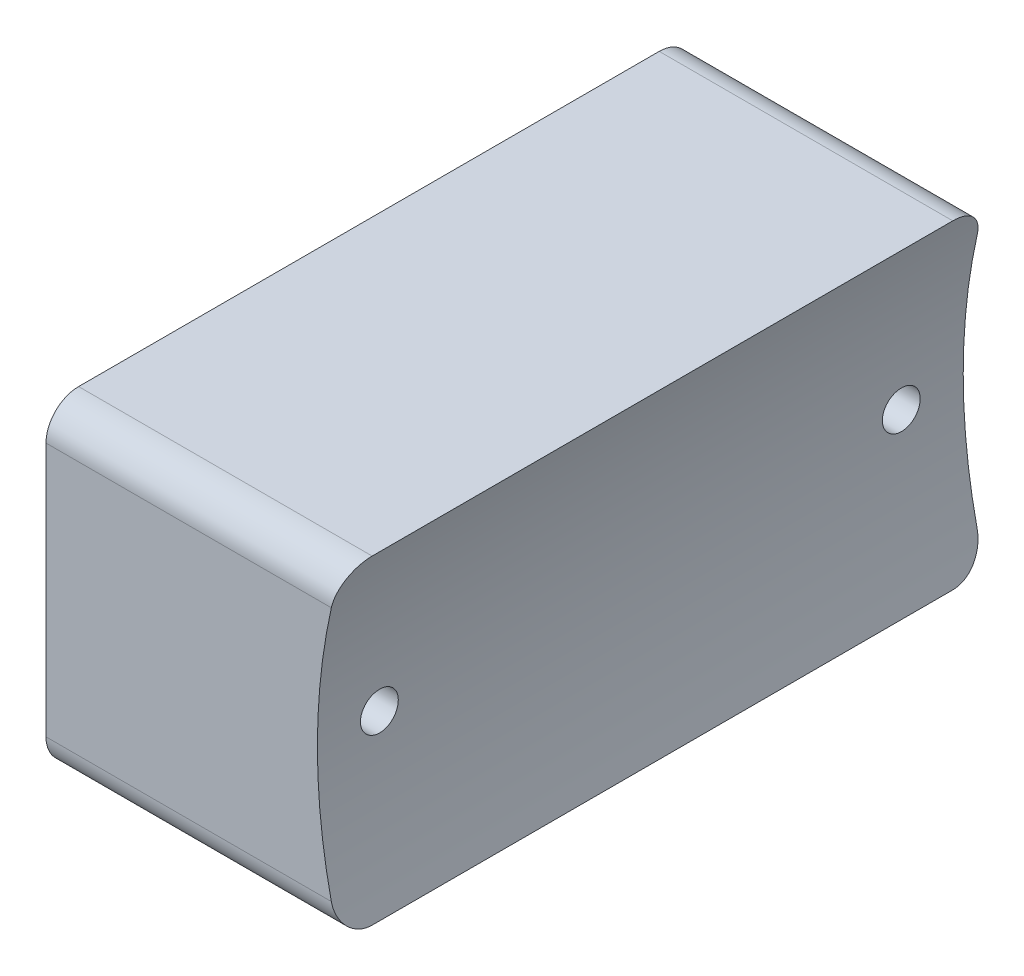
ISO-10303-21;
HEADER;
FILE_DESCRIPTION(('STEP AP214'),'2;1');
FILE_NAME('part.step','',(''),(''),'','','');
FILE_SCHEMA(('AUTOMOTIVE_DESIGN { 1 0 10303 214 1 1 1 1 }'));
ENDSEC;
DATA;
#1=APPLICATION_CONTEXT('core data for automotive mechanical design processes');
#2=APPLICATION_PROTOCOL_DEFINITION('international standard','automotive_design',2000,#1);
#3=PRODUCT_CONTEXT('',#1,'mechanical');
#4=PRODUCT('Part','Part','',(#3));
#5=PRODUCT_RELATED_PRODUCT_CATEGORY('part','',(#4));
#6=PRODUCT_DEFINITION_FORMATION('','',#4);
#7=PRODUCT_DEFINITION_CONTEXT('part definition',#1,'design');
#8=PRODUCT_DEFINITION('design','',#6,#7);
#9=PRODUCT_DEFINITION_SHAPE('','',#8);
#10=(LENGTH_UNIT() NAMED_UNIT(*) SI_UNIT(.MILLI.,.METRE.));
#11=(NAMED_UNIT(*) PLANE_ANGLE_UNIT() SI_UNIT($,.RADIAN.));
#12=(NAMED_UNIT(*) SI_UNIT($,.STERADIAN.) SOLID_ANGLE_UNIT());
#13=UNCERTAINTY_MEASURE_WITH_UNIT(LENGTH_MEASURE(1.E-05),#10,'distance_accuracy_value','');
#14=(GEOMETRIC_REPRESENTATION_CONTEXT(3) GLOBAL_UNCERTAINTY_ASSIGNED_CONTEXT((#13)) GLOBAL_UNIT_ASSIGNED_CONTEXT((#10,
#11,#12)) REPRESENTATION_CONTEXT('',''));
#15=CARTESIAN_POINT('',(0.,0.,0.));
#16=DIRECTION('',(0.,0.,1.));
#17=DIRECTION('',(1.,0.,0.));
#18=AXIS2_PLACEMENT_3D('',#15,#16,#17);
#19=CARTESIAN_POINT('',(22.5,12.25,24.75));
#20=DIRECTION('',(0.,-1.,0.));
#21=DIRECTION('',(0.,0.,-1.));
#22=AXIS2_PLACEMENT_3D('',#19,#20,#21);
#23=PLANE('',#22);
#24=DIRECTION('',(0.,0.,1.));
#25=VECTOR('',#24,1.);
#26=CARTESIAN_POINT('',(0.,12.25,24.75));
#27=LINE('',#26,#25);
#28=CARTESIAN_POINT('',(0.,12.25,-22.25));
#29=VERTEX_POINT('',#28);
#30=CARTESIAN_POINT('',(0.,12.25,22.25));
#31=VERTEX_POINT('',#30);
#32=EDGE_CURVE('E184',#29,#31,#27,.T.);
#33=ORIENTED_EDGE('',*,*,#32,.T.);
#34=DIRECTION('',(-1.,0.,0.));
#35=VECTOR('',#34,1.);
#36=CARTESIAN_POINT('',(22.5,12.25,22.25));
#37=LINE('',#36,#35);
#38=CARTESIAN_POINT('',(22.5,12.25,22.25));
#39=VERTEX_POINT('',#38);
#40=EDGE_CURVE('E59',#31,#39,#37,.F.);
#41=ORIENTED_EDGE('',*,*,#40,.T.);
#42=DIRECTION('',(0.,0.,1.));
#43=VECTOR('',#42,1.);
#44=CARTESIAN_POINT('',(22.5,12.25,24.75));
#45=LINE('',#44,#43);
#46=CARTESIAN_POINT('',(22.5,12.25,-22.25));
#47=VERTEX_POINT('',#46);
#48=EDGE_CURVE('E193',#47,#39,#45,.T.);
#49=ORIENTED_EDGE('',*,*,#48,.F.);
#50=DIRECTION('',(-1.,0.,0.));
#51=VECTOR('',#50,1.);
#52=CARTESIAN_POINT('',(22.5,12.25,-22.25));
#53=LINE('',#52,#51);
#54=EDGE_CURVE('E271',#47,#29,#53,.T.);
#55=ORIENTED_EDGE('',*,*,#54,.T.);
#56=EDGE_LOOP('',(#33,#41,#49,#55));
#57=FACE_BOUND('',#56,.T.);
#58=ADVANCED_FACE('F43',(#57),#23,.F.);
#59=CARTESIAN_POINT('',(22.5,-12.25,24.75));
#60=DIRECTION('',(0.,0.,-1.));
#61=DIRECTION('',(0.,1.,0.));
#62=AXIS2_PLACEMENT_3D('',#59,#60,#61);
#63=PLANE('',#62);
#64=DIRECTION('',(0.,-1.,0.));
#65=VECTOR('',#64,1.);
#66=CARTESIAN_POINT('',(0.,-12.25,24.75));
#67=LINE('',#66,#65);
#68=CARTESIAN_POINT('',(0.,9.75,24.75));
#69=VERTEX_POINT('',#68);
#70=CARTESIAN_POINT('',(0.,-9.75,24.75));
#71=VERTEX_POINT('',#70);
#72=EDGE_CURVE('E201',#69,#71,#67,.T.);
#73=ORIENTED_EDGE('',*,*,#72,.T.);
#74=DIRECTION('',(-1.,0.,0.));
#75=VECTOR('',#74,1.);
#76=CARTESIAN_POINT('',(22.5,-9.75,24.75));
#77=LINE('',#76,#75);
#78=CARTESIAN_POINT('',(21.8694945585489,-9.75,24.75));
#79=VERTEX_POINT('',#78);
#80=EDGE_CURVE('E292',#71,#79,#77,.F.);
#81=ORIENTED_EDGE('',*,*,#80,.T.);
#82=CARTESIAN_POINT('',(65.8005484953713,0.,24.75));
#83=DIRECTION('',(0.,0.,-1.));
#84=DIRECTION('',(0.,1.,0.));
#85=AXIS2_PLACEMENT_3D('',#82,#83,#84);
#86=CIRCLE('',#85,45.);
#87=CARTESIAN_POINT('',(21.8694945585489,9.75,24.75));
#88=VERTEX_POINT('',#87);
#89=EDGE_CURVE('E165',#79,#88,#86,.T.);
#90=ORIENTED_EDGE('',*,*,#89,.T.);
#91=DIRECTION('',(-1.,0.,0.));
#92=VECTOR('',#91,1.);
#93=CARTESIAN_POINT('',(22.5,9.75,24.75));
#94=LINE('',#93,#92);
#95=EDGE_CURVE('E294',#88,#69,#94,.T.);
#96=ORIENTED_EDGE('',*,*,#95,.T.);
#97=EDGE_LOOP('',(#73,#81,#90,#96));
#98=FACE_BOUND('',#97,.T.);
#99=ADVANCED_FACE('F245',(#98),#63,.F.);
#100=CARTESIAN_POINT('',(22.5,-12.25,24.75));
#101=DIRECTION('',(0.,1.,0.));
#102=DIRECTION('',(0.,0.,1.));
#103=AXIS2_PLACEMENT_3D('',#100,#101,#102);
#104=PLANE('',#103);
#105=DIRECTION('',(0.,0.,-1.));
#106=VECTOR('',#105,1.);
#107=CARTESIAN_POINT('',(22.5,-12.25,24.75));
#108=LINE('',#107,#106);
#109=CARTESIAN_POINT('',(22.5,-12.25,22.25));
#110=VERTEX_POINT('',#109);
#111=CARTESIAN_POINT('',(22.5,-12.25,-22.25));
#112=VERTEX_POINT('',#111);
#113=EDGE_CURVE('E195',#110,#112,#108,.T.);
#114=ORIENTED_EDGE('',*,*,#113,.F.);
#115=DIRECTION('',(-1.,0.,0.));
#116=VECTOR('',#115,1.);
#117=CARTESIAN_POINT('',(22.5,-12.25,22.25));
#118=LINE('',#117,#116);
#119=CARTESIAN_POINT('',(0.,-12.25,22.25));
#120=VERTEX_POINT('',#119);
#121=EDGE_CURVE('E321',#110,#120,#118,.T.);
#122=ORIENTED_EDGE('',*,*,#121,.T.);
#123=DIRECTION('',(0.,0.,-1.));
#124=VECTOR('',#123,1.);
#125=CARTESIAN_POINT('',(0.,-12.25,24.75));
#126=LINE('',#125,#124);
#127=CARTESIAN_POINT('',(0.,-12.25,-22.25));
#128=VERTEX_POINT('',#127);
#129=EDGE_CURVE('E204',#120,#128,#126,.T.);
#130=ORIENTED_EDGE('',*,*,#129,.T.);
#131=DIRECTION('',(-1.,0.,0.));
#132=VECTOR('',#131,1.);
#133=CARTESIAN_POINT('',(22.5,-12.25,-22.25));
#134=LINE('',#133,#132);
#135=EDGE_CURVE('E199',#128,#112,#134,.F.);
#136=ORIENTED_EDGE('',*,*,#135,.T.);
#137=EDGE_LOOP('',(#114,#122,#130,#136));
#138=FACE_BOUND('',#137,.T.);
#139=ADVANCED_FACE('F251',(#138),#104,.F.);
#140=CARTESIAN_POINT('',(22.5,-12.25,-24.75));
#141=DIRECTION('',(0.,0.,1.));
#142=DIRECTION('',(1.,0.,0.));
#143=AXIS2_PLACEMENT_3D('',#140,#141,#142);
#144=PLANE('',#143);
#145=CARTESIAN_POINT('',(65.8005484953713,0.,-24.75));
#146=DIRECTION('',(0.,0.,-1.));
#147=DIRECTION('',(1.,0.,0.));
#148=AXIS2_PLACEMENT_3D('',#145,#146,#147);
#149=CIRCLE('',#148,45.);
#150=CARTESIAN_POINT('',(21.8694945585489,-9.75,-24.75));
#151=VERTEX_POINT('',#150);
#152=CARTESIAN_POINT('',(21.8694945585489,9.75,-24.75));
#153=VERTEX_POINT('',#152);
#154=EDGE_CURVE('E284',#151,#153,#149,.T.);
#155=ORIENTED_EDGE('',*,*,#154,.F.);
#156=DIRECTION('',(-1.,0.,0.));
#157=VECTOR('',#156,1.);
#158=CARTESIAN_POINT('',(22.5,-9.75,-24.75));
#159=LINE('',#158,#157);
#160=CARTESIAN_POINT('',(0.,-9.75,-24.75));
#161=VERTEX_POINT('',#160);
#162=EDGE_CURVE('E11',#151,#161,#159,.T.);
#163=ORIENTED_EDGE('',*,*,#162,.T.);
#164=DIRECTION('',(0.,1.,0.));
#165=VECTOR('',#164,1.);
#166=CARTESIAN_POINT('',(0.,-12.25,-24.75));
#167=LINE('',#166,#165);
#168=CARTESIAN_POINT('',(0.,9.75,-24.75));
#169=VERTEX_POINT('',#168);
#170=EDGE_CURVE('E196',#161,#169,#167,.T.);
#171=ORIENTED_EDGE('',*,*,#170,.T.);
#172=DIRECTION('',(-1.,0.,0.));
#173=VECTOR('',#172,1.);
#174=CARTESIAN_POINT('',(22.5,9.75,-24.75));
#175=LINE('',#174,#173);
#176=EDGE_CURVE('E52',#169,#153,#175,.F.);
#177=ORIENTED_EDGE('',*,*,#176,.T.);
#178=EDGE_LOOP('',(#155,#163,#171,#177));
#179=FACE_BOUND('',#178,.T.);
#180=ADVANCED_FACE('F283',(#179),#144,.F.);
#181=CARTESIAN_POINT('',(0.,0.,0.));
#182=DIRECTION('',(1.,0.,0.));
#183=DIRECTION('',(0.,0.,-1.));
#184=AXIS2_PLACEMENT_3D('',#181,#182,#183);
#185=PLANE('',#184);
#186=DIRECTION('',(0.,0.,-1.));
#187=VECTOR('',#186,1.);
#188=CARTESIAN_POINT('',(0.,10.,-7.59999999999674));
#189=LINE('',#188,#187);
#190=CARTESIAN_POINT('',(0.,10.,7.60000000000326));
#191=VERTEX_POINT('',#190);
#192=CARTESIAN_POINT('',(0.,10.,-7.59999999999674));
#193=VERTEX_POINT('',#192);
#194=EDGE_CURVE('E171',#191,#193,#189,.T.);
#195=ORIENTED_EDGE('',*,*,#194,.F.);
#196=DIRECTION('',(0.,1.,0.));
#197=VECTOR('',#196,1.);
#198=CARTESIAN_POINT('',(0.,7.5,7.60000000000326));
#199=LINE('',#198,#197);
#200=CARTESIAN_POINT('',(0.,7.5,7.60000000000326));
#201=VERTEX_POINT('',#200);
#202=EDGE_CURVE('E142',#201,#191,#199,.T.);
#203=ORIENTED_EDGE('',*,*,#202,.F.);
#204=DIRECTION('',(0.,0.,1.));
#205=VECTOR('',#204,1.);
#206=CARTESIAN_POINT('',(0.,7.5,-7.59999999999674));
#207=LINE('',#206,#205);
#208=CARTESIAN_POINT('',(0.,7.5,-7.59999999999674));
#209=VERTEX_POINT('',#208);
#210=EDGE_CURVE('E159',#209,#201,#207,.T.);
#211=ORIENTED_EDGE('',*,*,#210,.F.);
#212=DIRECTION('',(0.,-1.,0.));
#213=VECTOR('',#212,1.);
#214=CARTESIAN_POINT('',(0.,7.5,-7.59999999999674));
#215=LINE('',#214,#213);
#216=EDGE_CURVE('E162',#193,#209,#215,.T.);
#217=ORIENTED_EDGE('',*,*,#216,.F.);
#218=EDGE_LOOP('',(#195,#203,#211,#217));
#219=FACE_BOUND('',#218,.T.);
#220=CARTESIAN_POINT('',(0.,-7.25,-20.));
#221=DIRECTION('',(-1.,0.,0.));
#222=DIRECTION('',(0.,0.,1.));
#223=AXIS2_PLACEMENT_3D('',#220,#221,#222);
#224=CIRCLE('',#223,2.5);
#225=CARTESIAN_POINT('',(0.,-7.25,-17.5));
#226=VERTEX_POINT('',#225);
#227=EDGE_CURVE('E185',#226,#226,#224,.T.);
#228=ORIENTED_EDGE('',*,*,#227,.F.);
#229=EDGE_LOOP('',(#228));
#230=FACE_BOUND('',#229,.T.);
#231=CARTESIAN_POINT('',(0.,-7.25,20.));
#232=DIRECTION('',(-1.,0.,0.));
#233=DIRECTION('',(0.,0.,1.));
#234=AXIS2_PLACEMENT_3D('',#231,#232,#233);
#235=CIRCLE('',#234,2.5);
#236=CARTESIAN_POINT('',(0.,-7.25,22.5));
#237=VERTEX_POINT('',#236);
#238=EDGE_CURVE('E188',#237,#237,#235,.T.);
#239=ORIENTED_EDGE('',*,*,#238,.F.);
#240=EDGE_LOOP('',(#239));
#241=FACE_BOUND('',#240,.T.);
#242=ORIENTED_EDGE('',*,*,#129,.F.);
#243=CARTESIAN_POINT('',(0.,-9.75,22.25));
#244=DIRECTION('',(1.,0.,0.));
#245=DIRECTION('',(0.,0.,-1.));
#246=AXIS2_PLACEMENT_3D('',#243,#244,#245);
#247=CIRCLE('',#246,2.5);
#248=EDGE_CURVE('E329',#120,#71,#247,.F.);
#249=ORIENTED_EDGE('',*,*,#248,.T.);
#250=ORIENTED_EDGE('',*,*,#72,.F.);
#251=CARTESIAN_POINT('',(0.,9.75,22.25));
#252=DIRECTION('',(1.,0.,0.));
#253=DIRECTION('',(0.,0.,-1.));
#254=AXIS2_PLACEMENT_3D('',#251,#252,#253);
#255=CIRCLE('',#254,2.5);
#256=EDGE_CURVE('E323',#69,#31,#255,.F.);
#257=ORIENTED_EDGE('',*,*,#256,.T.);
#258=ORIENTED_EDGE('',*,*,#32,.F.);
#259=CARTESIAN_POINT('',(0.,9.75,-22.25));
#260=DIRECTION('',(1.,0.,0.));
#261=DIRECTION('',(0.,0.,-1.));
#262=AXIS2_PLACEMENT_3D('',#259,#260,#261);
#263=CIRCLE('',#262,2.5);
#264=EDGE_CURVE('E320',#29,#169,#263,.F.);
#265=ORIENTED_EDGE('',*,*,#264,.T.);
#266=ORIENTED_EDGE('',*,*,#170,.F.);
#267=CARTESIAN_POINT('',(0.,-9.75,-22.25));
#268=DIRECTION('',(1.,0.,0.));
#269=DIRECTION('',(0.,0.,-1.));
#270=AXIS2_PLACEMENT_3D('',#267,#268,#269);
#271=CIRCLE('',#270,2.5);
#272=EDGE_CURVE('E315',#161,#128,#271,.F.);
#273=ORIENTED_EDGE('',*,*,#272,.T.);
#274=EDGE_LOOP('',(#242,#249,#250,#257,#258,#265,#266,#273));
#275=FACE_BOUND('',#274,.T.);
#276=ADVANCED_FACE('F318',(#219,#230,#241,#275),#185,.F.);
#277=CARTESIAN_POINT('',(3.,-7.25,20.));
#278=DIRECTION('',(-1.,0.,0.));
#279=DIRECTION('',(0.,0.,1.));
#280=AXIS2_PLACEMENT_3D('',#277,#278,#279);
#281=CYLINDRICAL_SURFACE('',#280,2.5);
#282=CARTESIAN_POINT('',(3.,-7.25,20.));
#283=DIRECTION('',(-1.,0.,0.));
#284=DIRECTION('',(0.,0.,1.));
#285=AXIS2_PLACEMENT_3D('',#282,#283,#284);
#286=CIRCLE('',#285,2.5);
#287=CARTESIAN_POINT('',(3.,-7.25,22.5));
#288=VERTEX_POINT('',#287);
#289=EDGE_CURVE('E177',#288,#288,#286,.T.);
#290=ORIENTED_EDGE('',*,*,#289,.F.);
#291=EDGE_LOOP('',(#290));
#292=FACE_BOUND('',#291,.T.);
#293=ORIENTED_EDGE('',*,*,#238,.T.);
#294=EDGE_LOOP('',(#293));
#295=FACE_BOUND('',#294,.T.);
#296=ADVANCED_FACE('F348',(#292,#295),#281,.F.);
#297=CARTESIAN_POINT('',(3.,-7.25,20.));
#298=DIRECTION('',(-1.,0.,0.));
#299=DIRECTION('',(0.,0.,1.));
#300=AXIS2_PLACEMENT_3D('',#297,#298,#299);
#301=PLANE('',#300);
#302=ORIENTED_EDGE('',*,*,#289,.T.);
#303=EDGE_LOOP('',(#302));
#304=FACE_BOUND('',#303,.T.);
#305=ADVANCED_FACE('F350',(#304),#301,.T.);
#306=CARTESIAN_POINT('',(3.,-7.25,-20.));
#307=DIRECTION('',(-1.,0.,0.));
#308=DIRECTION('',(0.,0.,1.));
#309=AXIS2_PLACEMENT_3D('',#306,#307,#308);
#310=CYLINDRICAL_SURFACE('',#309,2.5);
#311=CARTESIAN_POINT('',(3.,-7.25,-20.));
#312=DIRECTION('',(-1.,0.,0.));
#313=DIRECTION('',(0.,0.,1.));
#314=AXIS2_PLACEMENT_3D('',#311,#312,#313);
#315=CIRCLE('',#314,2.5);
#316=CARTESIAN_POINT('',(3.,-7.25,-17.5));
#317=VERTEX_POINT('',#316);
#318=EDGE_CURVE('E181',#317,#317,#315,.T.);
#319=ORIENTED_EDGE('',*,*,#318,.F.);
#320=EDGE_LOOP('',(#319));
#321=FACE_BOUND('',#320,.T.);
#322=ORIENTED_EDGE('',*,*,#227,.T.);
#323=EDGE_LOOP('',(#322));
#324=FACE_BOUND('',#323,.T.);
#325=ADVANCED_FACE('F353',(#321,#324),#310,.F.);
#326=CARTESIAN_POINT('',(3.,-7.25,-20.));
#327=DIRECTION('',(-1.,0.,0.));
#328=DIRECTION('',(0.,0.,1.));
#329=AXIS2_PLACEMENT_3D('',#326,#327,#328);
#330=PLANE('',#329);
#331=ORIENTED_EDGE('',*,*,#318,.T.);
#332=EDGE_LOOP('',(#331));
#333=FACE_BOUND('',#332,.T.);
#334=ADVANCED_FACE('F360',(#333),#330,.T.);
#335=CARTESIAN_POINT('',(8.,7.5,7.60000000000326));
#336=DIRECTION('',(0.,0.,1.));
#337=DIRECTION('',(1.,0.,0.));
#338=AXIS2_PLACEMENT_3D('',#335,#336,#337);
#339=PLANE('',#338);
#340=ORIENTED_EDGE('',*,*,#202,.T.);
#341=DIRECTION('',(-1.,0.,0.));
#342=VECTOR('',#341,1.);
#343=CARTESIAN_POINT('',(8.,10.,7.60000000000326));
#344=LINE('',#343,#342);
#345=CARTESIAN_POINT('',(8.,10.,7.60000000000326));
#346=VERTEX_POINT('',#345);
#347=EDGE_CURVE('E135',#346,#191,#344,.T.);
#348=ORIENTED_EDGE('',*,*,#347,.F.);
#349=DIRECTION('',(0.,1.,0.));
#350=VECTOR('',#349,1.);
#351=CARTESIAN_POINT('',(8.,7.5,7.60000000000326));
#352=LINE('',#351,#350);
#353=CARTESIAN_POINT('',(8.,7.5,7.60000000000326));
#354=VERTEX_POINT('',#353);
#355=EDGE_CURVE('E139',#354,#346,#352,.T.);
#356=ORIENTED_EDGE('',*,*,#355,.F.);
#357=DIRECTION('',(-1.,0.,0.));
#358=VECTOR('',#357,1.);
#359=CARTESIAN_POINT('',(8.,7.5,7.60000000000326));
#360=LINE('',#359,#358);
#361=EDGE_CURVE('E175',#354,#201,#360,.T.);
#362=ORIENTED_EDGE('',*,*,#361,.T.);
#363=EDGE_LOOP('',(#340,#348,#356,#362));
#364=FACE_BOUND('',#363,.T.);
#365=ADVANCED_FACE('F137',(#364),#339,.F.);
#366=CARTESIAN_POINT('',(8.,7.5,-7.59999999999674));
#367=DIRECTION('',(0.,-1.,0.));
#368=DIRECTION('',(0.,0.,-1.));
#369=AXIS2_PLACEMENT_3D('',#366,#367,#368);
#370=PLANE('',#369);
#371=ORIENTED_EDGE('',*,*,#210,.T.);
#372=ORIENTED_EDGE('',*,*,#361,.F.);
#373=DIRECTION('',(0.,0.,1.));
#374=VECTOR('',#373,1.);
#375=CARTESIAN_POINT('',(8.,7.5,-7.59999999999674));
#376=LINE('',#375,#374);
#377=CARTESIAN_POINT('',(8.,7.5,-7.59999999999674));
#378=VERTEX_POINT('',#377);
#379=EDGE_CURVE('E147',#378,#354,#376,.T.);
#380=ORIENTED_EDGE('',*,*,#379,.F.);
#381=DIRECTION('',(-1.,0.,0.));
#382=VECTOR('',#381,1.);
#383=CARTESIAN_POINT('',(8.,7.5,-7.59999999999674));
#384=LINE('',#383,#382);
#385=EDGE_CURVE('E178',#378,#209,#384,.T.);
#386=ORIENTED_EDGE('',*,*,#385,.T.);
#387=EDGE_LOOP('',(#371,#372,#380,#386));
#388=FACE_BOUND('',#387,.T.);
#389=ADVANCED_FACE('F367',(#388),#370,.F.);
#390=CARTESIAN_POINT('',(8.,7.5,-7.59999999999674));
#391=DIRECTION('',(0.,0.,-1.));
#392=DIRECTION('',(-1.,0.,0.));
#393=AXIS2_PLACEMENT_3D('',#390,#391,#392);
#394=PLANE('',#393);
#395=ORIENTED_EDGE('',*,*,#216,.T.);
#396=ORIENTED_EDGE('',*,*,#385,.F.);
#397=DIRECTION('',(0.,-1.,0.));
#398=VECTOR('',#397,1.);
#399=CARTESIAN_POINT('',(8.,7.5,-7.59999999999674));
#400=LINE('',#399,#398);
#401=CARTESIAN_POINT('',(8.,10.,-7.59999999999674));
#402=VERTEX_POINT('',#401);
#403=EDGE_CURVE('E155',#402,#378,#400,.T.);
#404=ORIENTED_EDGE('',*,*,#403,.F.);
#405=DIRECTION('',(-1.,0.,0.));
#406=VECTOR('',#405,1.);
#407=CARTESIAN_POINT('',(8.,10.,-7.59999999999674));
#408=LINE('',#407,#406);
#409=EDGE_CURVE('E146',#402,#193,#408,.T.);
#410=ORIENTED_EDGE('',*,*,#409,.T.);
#411=EDGE_LOOP('',(#395,#396,#404,#410));
#412=FACE_BOUND('',#411,.T.);
#413=ADVANCED_FACE('F370',(#412),#394,.F.);
#414=CARTESIAN_POINT('',(8.,10.,-7.59999999999674));
#415=DIRECTION('',(0.,1.,0.));
#416=DIRECTION('',(0.,0.,1.));
#417=AXIS2_PLACEMENT_3D('',#414,#415,#416);
#418=PLANE('',#417);
#419=ORIENTED_EDGE('',*,*,#194,.T.);
#420=ORIENTED_EDGE('',*,*,#409,.F.);
#421=DIRECTION('',(0.,0.,-1.));
#422=VECTOR('',#421,1.);
#423=CARTESIAN_POINT('',(8.,10.,-7.59999999999674));
#424=LINE('',#423,#422);
#425=EDGE_CURVE('E150',#346,#402,#424,.T.);
#426=ORIENTED_EDGE('',*,*,#425,.F.);
#427=ORIENTED_EDGE('',*,*,#347,.T.);
#428=EDGE_LOOP('',(#419,#420,#426,#427));
#429=FACE_BOUND('',#428,.T.);
#430=ADVANCED_FACE('F151',(#429),#418,.F.);
#431=CARTESIAN_POINT('',(8.,0.,0.));
#432=DIRECTION('',(1.,0.,0.));
#433=DIRECTION('',(0.,0.,-1.));
#434=AXIS2_PLACEMENT_3D('',#431,#432,#433);
#435=PLANE('',#434);
#436=ORIENTED_EDGE('',*,*,#355,.T.);
#437=ORIENTED_EDGE('',*,*,#425,.T.);
#438=ORIENTED_EDGE('',*,*,#403,.T.);
#439=ORIENTED_EDGE('',*,*,#379,.T.);
#440=EDGE_LOOP('',(#436,#437,#438,#439));
#441=FACE_BOUND('',#440,.T.);
#442=ADVANCED_FACE('F157',(#441),#435,.F.);
#443=CARTESIAN_POINT('',(65.8005484953713,0.,25.25));
#444=DIRECTION('',(0.,0.,-1.));
#445=DIRECTION('',(-1.,0.,0.));
#446=AXIS2_PLACEMENT_3D('',#443,#444,#445);
#447=CYLINDRICAL_SURFACE('',#446,45.);
#448=CARTESIAN_POINT('',(20.8005484953713,0.,21.45));
#449=CARTESIAN_POINT('',(20.8005488099205,0.0814244626196129,21.449996396117));
#450=CARTESIAN_POINT('',(20.8007718639297,0.162907427514251,21.4431184154617));
#451=CARTESIAN_POINT('',(20.8016402275495,0.323627719017818,21.4157771016316));
#452=CARTESIAN_POINT('',(20.8022860409403,0.402862248603707,21.3952975597655));
#453=CARTESIAN_POINT('',(20.8039267902565,0.556734078279249,21.3413381291684));
#454=CARTESIAN_POINT('',(20.8049215547534,0.631373614616901,21.3078646231007));
#455=CARTESIAN_POINT('',(20.8071480139421,0.773953262168097,21.2288766662775));
#456=CARTESIAN_POINT('',(20.8083796509414,0.841894998610652,21.1833651464811));
#457=CARTESIAN_POINT('',(20.8109418796916,0.969205510334485,21.0815664082029));
#458=CARTESIAN_POINT('',(20.8122725136321,1.02857059841444,21.0252745791824));
#459=CARTESIAN_POINT('',(20.8148823945695,1.13701157191676,20.9035213829566));
#460=CARTESIAN_POINT('',(20.8161616395137,1.18608704666104,20.838059649937));
#461=CARTESIAN_POINT('',(20.8185247101055,1.27256224832297,20.6998101899756));
#462=CARTESIAN_POINT('',(20.819608496772,1.30995964731564,20.6270210061881));
#463=CARTESIAN_POINT('',(20.8214580268576,1.37200201604757,20.4761932233477));
#464=CARTESIAN_POINT('',(20.8222237716505,1.39664704087146,20.3981546469715));
#465=CARTESIAN_POINT('',(20.8233505533655,1.43247684004426,20.2390722100027));
#466=CARTESIAN_POINT('',(20.8237117318111,1.44366632144975,20.1580294105889));
#467=CARTESIAN_POINT('',(20.8239890814792,1.45228190891927,19.9952149923199));
#468=CARTESIAN_POINT('',(20.823905254628,1.44970807456018,19.913443376621));
#469=CARTESIAN_POINT('',(20.8233021784513,1.4308740626372,19.7515244581282));
#470=CARTESIAN_POINT('',(20.8227830909804,1.41461897253565,19.6713765628869));
#471=CARTESIAN_POINT('',(20.8213682640442,1.36889174269369,19.5149477657282));
#472=CARTESIAN_POINT('',(20.8204725236836,1.33941957153753,19.4386668730027));
#473=CARTESIAN_POINT('',(20.8184051786107,1.26808895093826,19.2921210464302));
#474=CARTESIAN_POINT('',(20.8172335219961,1.22622817070439,19.2218572478486));
#475=CARTESIAN_POINT('',(20.8147464774065,1.13131033484488,19.0893525950115));
#476=CARTESIAN_POINT('',(20.8134310890438,1.07825324901582,19.0271117623997));
#477=CARTESIAN_POINT('',(20.8108041417528,0.962420126346055,18.9123901967277));
#478=CARTESIAN_POINT('',(20.8094925848391,0.899639678655407,18.8599139171052));
#479=CARTESIAN_POINT('',(20.8070217276864,0.766157496995453,18.7662453617019));
#480=CARTESIAN_POINT('',(20.8058624274728,0.695455761695799,18.7250530878162));
#481=CARTESIAN_POINT('',(20.803826746743,0.548135489250456,18.6551223377953));
#482=CARTESIAN_POINT('',(20.8029503694381,0.471516884956281,18.6263840030199));
#483=CARTESIAN_POINT('',(20.8015793741711,0.314538922840486,18.582179759659));
#484=CARTESIAN_POINT('',(20.8010847550127,0.23417957674159,18.5667138094835));
#485=CARTESIAN_POINT('',(20.8005331838529,0.072039941870962,18.5494988183701));
#486=CARTESIAN_POINT('',(20.8004760352444,-0.00973969203392177,18.5477436155729));
#487=CARTESIAN_POINT('',(20.8008053261912,-0.172432454008436,18.5579838835719));
#488=CARTESIAN_POINT('',(20.8011917651502,-0.253345583242628,18.5699793358853));
#489=CARTESIAN_POINT('',(20.8023645546721,-0.411991312472771,18.6073753063917));
#490=CARTESIAN_POINT('',(20.8031508217283,-0.489724572943821,18.6327730254751));
#491=CARTESIAN_POINT('',(20.8050346737477,-0.639824278002945,18.6962497388815));
#492=CARTESIAN_POINT('',(20.8061322594378,-0.712190710061127,18.7343287628102));
#493=CARTESIAN_POINT('',(20.808515608955,-0.849530890151437,18.8221030175001));
#494=CARTESIAN_POINT('',(20.8098014398769,-0.914501987585727,18.8718023937979));
#495=CARTESIAN_POINT('',(20.8124161519324,-1.03518058062021,18.981400484154));
#496=CARTESIAN_POINT('',(20.8137450331902,-1.0908880494737,19.0412992276596));
#497=CARTESIAN_POINT('',(20.8162965991988,-1.19147864108324,19.1696221573251));
#498=CARTESIAN_POINT('',(20.8175192448272,-1.23635778690848,19.2380494618289));
#499=CARTESIAN_POINT('',(20.8197198741337,-1.31399058804158,19.3814712133025));
#500=CARTESIAN_POINT('',(20.8206978584076,-1.34674427288004,19.4564656442779));
#501=CARTESIAN_POINT('',(20.822298618256,-1.39918942933315,19.6108778791385));
#502=CARTESIAN_POINT('',(20.8229214637157,-1.41888347098382,19.6902948093738));
#503=CARTESIAN_POINT('',(20.8237419169104,-1.44465872244861,19.8513100483828));
#504=CARTESIAN_POINT('',(20.8239395251953,-1.45073994986738,19.9329083543353));
#505=CARTESIAN_POINT('',(20.8238871988886,-1.44911665583794,20.0959302950058));
#506=CARTESIAN_POINT('',(20.8236374678388,-1.44141840413062,20.1773539922954));
#507=CARTESIAN_POINT('',(20.8227190430278,-1.41246757938447,20.3377525919142));
#508=CARTESIAN_POINT('',(20.8220503484383,-1.39121497954862,20.4167274894019));
#509=CARTESIAN_POINT('',(20.8203694110053,-1.33575968018191,20.5699888858505));
#510=CARTESIAN_POINT('',(20.8193571625988,-1.3015567709543,20.6442753088708));
#511=CARTESIAN_POINT('',(20.8171032699996,-1.22117368883685,20.7860501880898));
#512=CARTESIAN_POINT('',(20.815861633994,-1.17499394338829,20.8535388867731));
#513=CARTESIAN_POINT('',(20.8132883489235,-1.07194878312577,20.97983188446));
#514=CARTESIAN_POINT('',(20.8119566686574,-1.01507965207399,21.0386331504825));
#515=CARTESIAN_POINT('',(20.8093534006523,-0.892260267729263,21.1458700951548));
#516=CARTESIAN_POINT('',(20.8080818278659,-0.826307770594814,21.1943032050099));
#517=CARTESIAN_POINT('',(20.8057416304044,-0.687165780546031,21.2794384583458));
#518=CARTESIAN_POINT('',(20.8046731432421,-0.613971434684463,21.3161326646168));
#519=CARTESIAN_POINT('',(20.802861970357,-0.462513921818396,21.3766687212759));
#520=CARTESIAN_POINT('',(20.8021188966413,-0.384256919599302,21.4005258851824));
#521=CARTESIAN_POINT('',(20.8012406993975,-0.254588560646603,21.428393846034));
#522=CARTESIAN_POINT('',(20.8009822504281,-0.204018709503933,21.4364859460203));
#523=CARTESIAN_POINT('',(20.8006360496168,-0.1023069387288,21.4472901543791));
#524=CARTESIAN_POINT('',(20.8005482977167,-0.0511650192914686,21.4500022645866));
#525=CARTESIAN_POINT('',(20.8005484953713,0.,21.45));
#526=B_SPLINE_CURVE_WITH_KNOTS('',3,(#448,#449,#450,#451,#452,#453,#454,#455,#456,#457,#458,
#459,#460,#461,#462,#463,#464,#465,#466,#467,#468,#469,#470,#471,#472,#473,#474,#475,#476,#477,
#478,#479,#480,#481,#482,#483,#484,#485,#486,#487,#488,#489,#490,#491,#492,#493,#494,#495,#496,
#497,#498,#499,#500,#501,#502,#503,#504,#505,#506,#507,#508,#509,#510,#511,#512,#513,#514,#515,
#516,#517,#518,#519,#520,#521,#522,#523,#524,#525),.UNSPECIFIED.,.T.,.F.,(4,2,2,2,2,2,2,2,2,2,2,
2,2,2,2,2,2,2,2,2,2,2,2,2,2,2,2,2,2,2,2,2,2,2,2,2,2,2,4),(0.,0.24408662782298,0.488464651655721,
0.732722788061951,0.976921508298473,1.22122490199213,1.46553804444437,1.70989985759789,
1.95426061520739,2.19853586494862,2.44281005730338,2.68699345485115,2.93117743280273,
3.17540738072229,3.41963798749074,3.66397971189624,3.90832147733799,4.152666016137,
4.39700978926151,4.64124374352538,4.88547736950358,5.1296600066257,5.37384321382112,
5.6181136661446,5.8623848237331,6.1067455589758,6.3511056990932,6.59541773675718,
6.83972945846666,7.08393004521788,7.32813111475645,7.57233613866888,7.81653244834823,
8.06081381209226,8.30515562865588,8.54966230842292,8.7938766618552,8.94725441688459,
9.100632119599),.UNSPECIFIED.);
#527=CARTESIAN_POINT('',(20.8005484953713,0.,21.45));
#528=VERTEX_POINT('',#527);
#529=EDGE_CURVE('E217',#528,#528,#526,.T.);
#530=ORIENTED_EDGE('',*,*,#529,.T.);
#531=EDGE_LOOP('',(#530));
#532=FACE_BOUND('',#531,.T.);
#533=CARTESIAN_POINT('',(20.8005484953713,0.,-18.55));
#534=CARTESIAN_POINT('',(20.8005488099205,0.0814244626196131,-18.550003603883));
#535=CARTESIAN_POINT('',(20.8007718639297,0.162907427514252,-18.5568815845383));
#536=CARTESIAN_POINT('',(20.8016402275495,0.323627719017819,-18.5842228983684));
#537=CARTESIAN_POINT('',(20.8022860409403,0.402862248603707,-18.6047024402345));
#538=CARTESIAN_POINT('',(20.8039267902565,0.556734078279248,-18.6586618708316));
#539=CARTESIAN_POINT('',(20.8049215547534,0.631373614616899,-18.6921353768993));
#540=CARTESIAN_POINT('',(20.8071480139421,0.773953262168095,-18.7711233337225));
#541=CARTESIAN_POINT('',(20.8083796509414,0.841894998610651,-18.8166348535189));
#542=CARTESIAN_POINT('',(20.8109418796916,0.969205510334485,-18.9184335917971));
#543=CARTESIAN_POINT('',(20.8122725136321,1.02857059841444,-18.9747254208176));
#544=CARTESIAN_POINT('',(20.8148823945695,1.13701157191676,-19.0964786170434));
#545=CARTESIAN_POINT('',(20.8161616395137,1.18608704666104,-19.161940350063));
#546=CARTESIAN_POINT('',(20.8185247101055,1.27256224832297,-19.3001898100244));
#547=CARTESIAN_POINT('',(20.819608496772,1.30995964731564,-19.3729789938119));
#548=CARTESIAN_POINT('',(20.8214580268576,1.37200201604757,-19.5238067766523));
#549=CARTESIAN_POINT('',(20.8222237716505,1.39664704087146,-19.6018453530285));
#550=CARTESIAN_POINT('',(20.8233505533655,1.43247684004426,-19.7609277899973));
#551=CARTESIAN_POINT('',(20.8237117318111,1.44366632144975,-19.8419705894111));
#552=CARTESIAN_POINT('',(20.8239890814792,1.45228190891927,-20.0047850076801));
#553=CARTESIAN_POINT('',(20.823905254628,1.44970807456018,-20.086556623379));
#554=CARTESIAN_POINT('',(20.8233021784513,1.4308740626372,-20.2484755418718));
#555=CARTESIAN_POINT('',(20.8227830909804,1.41461897253565,-20.3286234371131));
#556=CARTESIAN_POINT('',(20.8213682640442,1.36889174269369,-20.4850522342718));
#557=CARTESIAN_POINT('',(20.8204725236836,1.33941957153753,-20.5613331269973));
#558=CARTESIAN_POINT('',(20.8184051786107,1.26808895093826,-20.7078789535698));
#559=CARTESIAN_POINT('',(20.8172335219961,1.22622817070439,-20.7781427521514));
#560=CARTESIAN_POINT('',(20.8147464774065,1.13131033484488,-20.9106474049885));
#561=CARTESIAN_POINT('',(20.8134310890438,1.07825324901582,-20.9728882376003));
#562=CARTESIAN_POINT('',(20.8108041417528,0.962420126346058,-21.0876098032723));
#563=CARTESIAN_POINT('',(20.8094925848391,0.89963967865541,-21.1400860828948));
#564=CARTESIAN_POINT('',(20.8070217276864,0.766157496995456,-21.2337546382981));
#565=CARTESIAN_POINT('',(20.8058624274728,0.695455761695802,-21.2749469121838));
#566=CARTESIAN_POINT('',(20.803826746743,0.548135489250458,-21.3448776622047));
#567=CARTESIAN_POINT('',(20.8029503694381,0.471516884956281,-21.3736159969801));
#568=CARTESIAN_POINT('',(20.8015793741711,0.314538922840485,-21.417820240341));
#569=CARTESIAN_POINT('',(20.8010847550127,0.234179576741588,-21.4332861905165));
#570=CARTESIAN_POINT('',(20.8005331838529,0.072039941870959,-21.4505011816299));
#571=CARTESIAN_POINT('',(20.8004760352444,-0.00973969203392455,-21.4522563844271));
#572=CARTESIAN_POINT('',(20.8008053261912,-0.172432454008438,-21.4420161164281));
#573=CARTESIAN_POINT('',(20.8011917651502,-0.253345583242628,-21.4300206641147));
#574=CARTESIAN_POINT('',(20.8023645546721,-0.41199131247277,-21.3926246936083));
#575=CARTESIAN_POINT('',(20.8031508217283,-0.48972457294382,-21.3672269745249));
#576=CARTESIAN_POINT('',(20.8050346737477,-0.639824278002944,-21.3037502611185));
#577=CARTESIAN_POINT('',(20.8061322594378,-0.712190710061126,-21.2656712371898));
#578=CARTESIAN_POINT('',(20.808515608955,-0.849530890151437,-21.1778969824999));
#579=CARTESIAN_POINT('',(20.8098014398769,-0.914501987585727,-21.1281976062021));
#580=CARTESIAN_POINT('',(20.8124161519324,-1.03518058062021,-21.018599515846));
#581=CARTESIAN_POINT('',(20.8137450331902,-1.0908880494737,-20.9587007723404));
#582=CARTESIAN_POINT('',(20.8162965991988,-1.19147864108324,-20.8303778426749));
#583=CARTESIAN_POINT('',(20.8175192448272,-1.23635778690848,-20.7619505381711));
#584=CARTESIAN_POINT('',(20.8197198741337,-1.31399058804158,-20.6185287866976));
#585=CARTESIAN_POINT('',(20.8206978584076,-1.34674427288004,-20.5435343557221));
#586=CARTESIAN_POINT('',(20.822298618256,-1.39918942933315,-20.3891221208615));
#587=CARTESIAN_POINT('',(20.8229214637157,-1.41888347098382,-20.3097051906262));
#588=CARTESIAN_POINT('',(20.8237419169104,-1.44465872244861,-20.1486899516172));
#589=CARTESIAN_POINT('',(20.8239395251953,-1.45073994986738,-20.0670916456647));
#590=CARTESIAN_POINT('',(20.8238871988886,-1.44911665583794,-19.9040697049942));
#591=CARTESIAN_POINT('',(20.8236374678388,-1.44141840413062,-19.8226460077046));
#592=CARTESIAN_POINT('',(20.8227190430278,-1.41246757938447,-19.6622474080858));
#593=CARTESIAN_POINT('',(20.8220503484383,-1.39121497954862,-19.5832725105981));
#594=CARTESIAN_POINT('',(20.8203694110053,-1.33575968018191,-19.4300111141495));
#595=CARTESIAN_POINT('',(20.8193571625988,-1.3015567709543,-19.3557246911292));
#596=CARTESIAN_POINT('',(20.8171032699996,-1.22117368883685,-19.2139498119102));
#597=CARTESIAN_POINT('',(20.815861633994,-1.17499394338829,-19.1464611132269));
#598=CARTESIAN_POINT('',(20.8132883489235,-1.07194878312577,-19.02016811554));
#599=CARTESIAN_POINT('',(20.8119566686574,-1.01507965207399,-18.9613668495175));
#600=CARTESIAN_POINT('',(20.8093534006523,-0.892260267729266,-18.8541299048452));
#601=CARTESIAN_POINT('',(20.8080818278659,-0.826307770594816,-18.8056967949901));
#602=CARTESIAN_POINT('',(20.8057416304044,-0.687165780546032,-18.7205615416542));
#603=CARTESIAN_POINT('',(20.8046731432421,-0.613971434684465,-18.6838673353832));
#604=CARTESIAN_POINT('',(20.802861970357,-0.462513921818398,-18.6233312787241));
#605=CARTESIAN_POINT('',(20.8021188966413,-0.384256919599303,-18.5994741148176));
#606=CARTESIAN_POINT('',(20.8012406993975,-0.254588560646603,-18.571606153966));
#607=CARTESIAN_POINT('',(20.8009822504281,-0.204018709503933,-18.5635140539797));
#608=CARTESIAN_POINT('',(20.8006360496168,-0.102306938728801,-18.5527098456209));
#609=CARTESIAN_POINT('',(20.8005482977167,-0.0511650192914687,-18.5499977354134));
#610=CARTESIAN_POINT('',(20.8005484953713,0.,-18.55));
#611=B_SPLINE_CURVE_WITH_KNOTS('',3,(#533,#534,#535,#536,#537,#538,#539,#540,#541,#542,#543,
#544,#545,#546,#547,#548,#549,#550,#551,#552,#553,#554,#555,#556,#557,#558,#559,#560,#561,#562,
#563,#564,#565,#566,#567,#568,#569,#570,#571,#572,#573,#574,#575,#576,#577,#578,#579,#580,#581,
#582,#583,#584,#585,#586,#587,#588,#589,#590,#591,#592,#593,#594,#595,#596,#597,#598,#599,#600,
#601,#602,#603,#604,#605,#606,#607,#608,#609,#610),.UNSPECIFIED.,.T.,.F.,(4,2,2,2,2,2,2,2,2,2,2,
2,2,2,2,2,2,2,2,2,2,2,2,2,2,2,2,2,2,2,2,2,2,2,2,2,2,2,4),(0.,0.24408662782298,0.488464651655721,
0.732722788061947,0.976921508298473,1.22122490199213,1.46553804444437,1.70989985759789,
1.95426061520739,2.19853586494862,2.44281005730338,2.68699345485115,2.93117743280273,
3.17540738072229,3.41963798749074,3.66397971189624,3.90832147733799,4.152666016137,
4.39700978926152,4.64124374352538,4.88547736950357,5.1296600066257,5.37384321382112,
5.6181136661446,5.8623848237331,6.1067455589758,6.3511056990932,6.59541773675718,
6.83972945846665,7.08393004521788,7.32813111475645,7.57233613866888,7.81653244834823,
8.06081381209225,8.30515562865588,8.54966230842292,8.7938766618552,8.94725441688459,
9.10063211959901),.UNSPECIFIED.);
#612=CARTESIAN_POINT('',(20.8005484953713,0.,-18.55));
#613=VERTEX_POINT('',#612);
#614=EDGE_CURVE('E209',#613,#613,#611,.T.);
#615=ORIENTED_EDGE('',*,*,#614,.T.);
#616=EDGE_LOOP('',(#615));
#617=FACE_BOUND('',#616,.T.);
#618=ORIENTED_EDGE('',*,*,#89,.F.);
#619=CARTESIAN_POINT('',(21.8694945585489,-9.75,24.75));
#620=CARTESIAN_POINT('',(21.8855004471709,-9.82212319290947,24.7499986264846));
#621=CARTESIAN_POINT('',(21.9016782154226,-9.89417073893007,24.7468772009709));
#622=CARTESIAN_POINT('',(21.9342680934332,-10.037671267951,24.7344391391561));
#623=CARTESIAN_POINT('',(21.950680189374,-10.1091242856204,24.7251228666984));
#624=CARTESIAN_POINT('',(22.0000672888263,-10.3217696691754,24.6879782144456));
#625=CARTESIAN_POINT('',(22.0332319294332,-10.4614230721947,24.6509537648838));
#626=CARTESIAN_POINT('',(22.0988934801905,-10.7324206234382,24.5533946026967));
#627=CARTESIAN_POINT('',(22.1313900935138,-10.8637611296371,24.4928496671236));
#628=CARTESIAN_POINT('',(22.1945058527714,-11.1143935409888,24.349816499688));
#629=CARTESIAN_POINT('',(22.2251254179818,-11.233688140717,24.267333190338));
#630=CARTESIAN_POINT('',(22.2830590710096,-11.4560582669612,24.0830587971023));
#631=CARTESIAN_POINT('',(22.3103907066903,-11.5592208662445,23.981378405808));
#632=CARTESIAN_POINT('',(22.3607065125221,-11.7468972088559,23.7610690025867));
#633=CARTESIAN_POINT('',(22.3836903038423,-11.8314093272603,23.6424385153646));
#634=CARTESIAN_POINT('',(22.4235921503044,-11.97686153076,23.3950439409588));
#635=CARTESIAN_POINT('',(22.4406585920473,-12.0383818373571,23.266644644499));
#636=CARTESIAN_POINT('',(22.4686732997462,-12.1388360331848,23.0007356474307));
#637=CARTESIAN_POINT('',(22.4796283975887,-12.1777951454942,22.8632363129884));
#638=CARTESIAN_POINT('',(22.4914675526151,-12.2198091971712,22.645432086352));
#639=CARTESIAN_POINT('',(22.4946630404191,-12.2311235676509,22.5667542718459));
#640=CARTESIAN_POINT('',(22.4989295043336,-12.2462164377451,22.4087312482708));
#641=CARTESIAN_POINT('',(22.500003382738,-12.2500052321458,22.3293871002474));
#642=CARTESIAN_POINT('',(22.5,-12.25,22.25));
#643=B_SPLINE_CURVE_WITH_KNOTS('',3,(#619,#620,#621,#622,#623,#624,#625,#626,#627,#628,#629,
#630,#631,#632,#633,#634,#635,#636,#637,#638,#639,#640,#641,#642),.UNSPECIFIED.,.F.,.F.,(4,2,2,
2,2,2,2,2,2,2,2,4),(0.,0.221495560783286,0.442978113567193,0.885413126604346,1.32804065520469,
1.77056895110445,2.21061947400981,2.65070832120258,3.07878991488245,3.5063919911514,
3.74469803777513,3.98267786298467),.UNSPECIFIED.);
#644=EDGE_CURVE('E264',#79,#110,#643,.T.);
#645=ORIENTED_EDGE('',*,*,#644,.T.);
#646=ORIENTED_EDGE('',*,*,#113,.T.);
#647=CARTESIAN_POINT('',(22.5,-12.25,-22.25));
#648=CARTESIAN_POINT('',(22.5000035349704,-12.2500081223024,-22.3185104886725));
#649=CARTESIAN_POINT('',(22.4992033394892,-12.2471839019023,-22.3870167481427));
#650=CARTESIAN_POINT('',(22.4960222226221,-12.2359334260766,-22.5235215552467));
#651=CARTESIAN_POINT('',(22.4936415199381,-12.2275079457225,-22.5915201718089));
#652=CARTESIAN_POINT('',(22.4873321424186,-12.205138955557,-22.7264007058992));
#653=CARTESIAN_POINT('',(22.4834064335173,-12.1912060181367,-22.793284508599));
#654=CARTESIAN_POINT('',(22.474062620116,-12.1579569633334,-22.9255749497549));
#655=CARTESIAN_POINT('',(22.4686445070492,-12.1386408150488,-22.9909815797291));
#656=CARTESIAN_POINT('',(22.4502454986291,-12.0728345694877,-23.1843046373594));
#657=CARTESIAN_POINT('',(22.4351143693107,-12.0184671937126,-23.3094404848133));
#658=CARTESIAN_POINT('',(22.3998677576251,-11.8905543552835,-23.5486369084358));
#659=CARTESIAN_POINT('',(22.3797514172387,-11.8170055911506,-23.6626955733697));
#660=CARTESIAN_POINT('',(22.3350299062405,-11.6514445378251,-23.8789173419071));
#661=CARTESIAN_POINT('',(22.3103500224601,-11.5591219202876,-23.9808275318913));
#662=CARTESIAN_POINT('',(22.2577954636413,-11.3595462868759,-24.1678308099934));
#663=CARTESIAN_POINT('',(22.2299198928728,-11.2522890831185,-24.2529191647636));
#664=CARTESIAN_POINT('',(22.1710505011195,-11.0218649139006,-24.4068995266674));
#665=CARTESIAN_POINT('',(22.1399824251705,-10.8982777612979,-24.4751341667444));
#666=CARTESIAN_POINT('',(22.0767276911383,-10.6416602756227,-24.5898031616109));
#667=CARTESIAN_POINT('',(22.0445413598953,-10.5086326901153,-24.6362438296552));
#668=CARTESIAN_POINT('',(21.9882760386056,-10.2711088448259,-24.6973376999058));
#669=CARTESIAN_POINT('',(21.9642006781713,-10.1678833769839,-24.7170549746049));
#670=CARTESIAN_POINT('',(21.9164551989228,-9.95981421767994,-24.7433881197163));
#671=CARTESIAN_POINT('',(21.8927846348729,-9.85497258251567,-24.7500194438048));
#672=CARTESIAN_POINT('',(21.8694945585489,-9.75,-24.75));
#673=B_SPLINE_CURVE_WITH_KNOTS('',3,(#647,#648,#649,#650,#651,#652,#653,#654,#655,#656,#657,
#658,#659,#660,#661,#662,#663,#664,#665,#666,#667,#668,#669,#670,#671,#672),.UNSPECIFIED.,.F.,
.F.,(4,2,2,2,2,2,2,2,2,2,2,2,4),(0.,0.205461249620716,0.410894074563805,0.615934440723718,
0.820975983913192,1.23070952016253,1.64051362588207,2.05774125133677,2.47508611021529,
2.90677859472371,3.33834594970338,3.66101392474679,3.98330062083471),.UNSPECIFIED.);
#674=EDGE_CURVE('E290',#112,#151,#673,.T.);
#675=ORIENTED_EDGE('',*,*,#674,.T.);
#676=ORIENTED_EDGE('',*,*,#154,.T.);
#677=CARTESIAN_POINT('',(21.8694945585489,9.75,-24.75));
#678=CARTESIAN_POINT('',(21.8855004471709,9.82212319290947,-24.7499986264846));
#679=CARTESIAN_POINT('',(21.9016782154226,9.89417073893007,-24.7468772009709));
#680=CARTESIAN_POINT('',(21.9342680934333,10.037671267951,-24.7344391391561));
#681=CARTESIAN_POINT('',(21.950680189374,10.1091242856204,-24.7251228666984));
#682=CARTESIAN_POINT('',(22.0000672888264,10.3217696691754,-24.6879782144456));
#683=CARTESIAN_POINT('',(22.0332319294332,10.4614230721947,-24.6509537648838));
#684=CARTESIAN_POINT('',(22.0988934801905,10.7324206234382,-24.5533946026967));
#685=CARTESIAN_POINT('',(22.1313900935138,10.8637611296371,-24.4928496671236));
#686=CARTESIAN_POINT('',(22.1945058527714,11.1143935409888,-24.349816499688));
#687=CARTESIAN_POINT('',(22.2251254179818,11.233688140717,-24.267333190338));
#688=CARTESIAN_POINT('',(22.2830590710096,11.4560582669612,-24.0830587971023));
#689=CARTESIAN_POINT('',(22.3103907066903,11.5592208662445,-23.981378405808));
#690=CARTESIAN_POINT('',(22.3607065125221,11.7468972088559,-23.7610690025867));
#691=CARTESIAN_POINT('',(22.3836903038423,11.8314093272603,-23.6424385153646));
#692=CARTESIAN_POINT('',(22.4235921503044,11.97686153076,-23.3950439409588));
#693=CARTESIAN_POINT('',(22.4406585920473,12.0383818373571,-23.266644644499));
#694=CARTESIAN_POINT('',(22.4686732997462,12.1388360331848,-23.0007356474307));
#695=CARTESIAN_POINT('',(22.4796283975887,12.1777951454942,-22.8632363129884));
#696=CARTESIAN_POINT('',(22.4914675526151,12.2198091971712,-22.6454320863521));
#697=CARTESIAN_POINT('',(22.4946630404191,12.2311235676509,-22.5667542718459));
#698=CARTESIAN_POINT('',(22.4989295043336,12.2462164377451,-22.4087312482708));
#699=CARTESIAN_POINT('',(22.500003382738,12.2500052321458,-22.3293871002474));
#700=CARTESIAN_POINT('',(22.5,12.25,-22.25));
#701=B_SPLINE_CURVE_WITH_KNOTS('',3,(#677,#678,#679,#680,#681,#682,#683,#684,#685,#686,#687,
#688,#689,#690,#691,#692,#693,#694,#695,#696,#697,#698,#699,#700),.UNSPECIFIED.,.F.,.F.,(4,2,2,
2,2,2,2,2,2,2,2,4),(0.,0.221495560783284,0.442978113567193,0.885413126604346,1.32804065520469,
1.77056895110445,2.21061947400982,2.65070832120258,3.07878991488244,3.5063919911514,
3.74469803777512,3.98267786298467),.UNSPECIFIED.);
#702=EDGE_CURVE('E66',#153,#47,#701,.T.);
#703=ORIENTED_EDGE('',*,*,#702,.T.);
#704=ORIENTED_EDGE('',*,*,#48,.T.);
#705=CARTESIAN_POINT('',(22.5,12.25,22.25));
#706=CARTESIAN_POINT('',(22.5000035349704,12.2500081223024,22.3185104886725));
#707=CARTESIAN_POINT('',(22.4992033394892,12.2471839019023,22.3870167481427));
#708=CARTESIAN_POINT('',(22.4960222226221,12.2359334260766,22.5235215552467));
#709=CARTESIAN_POINT('',(22.4936415199381,12.2275079457225,22.5915201718089));
#710=CARTESIAN_POINT('',(22.4873321424186,12.205138955557,22.7264007058992));
#711=CARTESIAN_POINT('',(22.4834064335173,12.1912060181367,22.793284508599));
#712=CARTESIAN_POINT('',(22.474062620116,12.1579569633334,22.9255749497549));
#713=CARTESIAN_POINT('',(22.4686445070492,12.1386408150488,22.9909815797291));
#714=CARTESIAN_POINT('',(22.4502454986291,12.0728345694877,23.1843046373594));
#715=CARTESIAN_POINT('',(22.4351143693107,12.0184671937126,23.3094404848133));
#716=CARTESIAN_POINT('',(22.3998677576251,11.8905543552835,23.5486369084358));
#717=CARTESIAN_POINT('',(22.3797514172387,11.8170055911506,23.6626955733697));
#718=CARTESIAN_POINT('',(22.3350299062405,11.6514445378251,23.8789173419071));
#719=CARTESIAN_POINT('',(22.3103500224601,11.5591219202876,23.9808275318913));
#720=CARTESIAN_POINT('',(22.2577954636413,11.3595462868759,24.1678308099934));
#721=CARTESIAN_POINT('',(22.2299198928728,11.2522890831185,24.2529191647636));
#722=CARTESIAN_POINT('',(22.1710505011195,11.0218649139006,24.4068995266674));
#723=CARTESIAN_POINT('',(22.1399824251705,10.8982777612979,24.4751341667444));
#724=CARTESIAN_POINT('',(22.0767276911383,10.6416602756227,24.5898031616109));
#725=CARTESIAN_POINT('',(22.0445413598953,10.5086326901153,24.6362438296552));
#726=CARTESIAN_POINT('',(21.9882760386055,10.2711088448259,24.6973376999058));
#727=CARTESIAN_POINT('',(21.9642006781713,10.1678833769839,24.7170549746049));
#728=CARTESIAN_POINT('',(21.9164551989228,9.95981421767994,24.7433881197163));
#729=CARTESIAN_POINT('',(21.8927846348729,9.85497258251567,24.7500194438048));
#730=CARTESIAN_POINT('',(21.8694945585489,9.75,24.75));
#731=B_SPLINE_CURVE_WITH_KNOTS('',3,(#705,#706,#707,#708,#709,#710,#711,#712,#713,#714,#715,
#716,#717,#718,#719,#720,#721,#722,#723,#724,#725,#726,#727,#728,#729,#730),.UNSPECIFIED.,.F.,
.F.,(4,2,2,2,2,2,2,2,2,2,2,2,4),(0.,0.205461249620719,0.410894074563805,0.615934440723718,
0.820975983913192,1.23070952016253,1.64051362588207,2.05774125133677,2.47508611021529,
2.90677859472371,3.33834594970339,3.66101392474679,3.98330062083471),.UNSPECIFIED.);
#732=EDGE_CURVE('E272',#39,#88,#731,.T.);
#733=ORIENTED_EDGE('',*,*,#732,.T.);
#734=EDGE_LOOP('',(#618,#645,#646,#675,#676,#703,#704,#733));
#735=FACE_BOUND('',#734,.T.);
#736=ADVANCED_FACE('F224',(#532,#617,#735),#447,.F.);
#737=CARTESIAN_POINT('',(12.5,0.,-20.));
#738=DIRECTION('',(1.,0.,0.));
#739=DIRECTION('',(0.,0.,-1.));
#740=AXIS2_PLACEMENT_3D('',#737,#738,#739);
#741=CYLINDRICAL_SURFACE('',#740,1.45);
#742=CARTESIAN_POINT('',(12.5,0.,-20.));
#743=DIRECTION('',(1.,0.,0.));
#744=DIRECTION('',(0.,0.,-1.));
#745=AXIS2_PLACEMENT_3D('',#742,#743,#744);
#746=CIRCLE('',#745,1.45);
#747=CARTESIAN_POINT('',(12.5,0.,-21.45));
#748=VERTEX_POINT('',#747);
#749=EDGE_CURVE('E518',#748,#748,#746,.T.);
#750=ORIENTED_EDGE('',*,*,#749,.F.);
#751=EDGE_LOOP('',(#750));
#752=FACE_BOUND('',#751,.T.);
#753=ORIENTED_EDGE('',*,*,#614,.F.);
#754=EDGE_LOOP('',(#753));
#755=FACE_BOUND('',#754,.T.);
#756=ADVANCED_FACE('F228',(#752,#755),#741,.F.);
#757=CARTESIAN_POINT('',(12.5,0.,-20.));
#758=DIRECTION('',(1.,0.,0.));
#759=DIRECTION('',(0.,0.,-1.));
#760=AXIS2_PLACEMENT_3D('',#757,#758,#759);
#761=PLANE('',#760);
#762=ORIENTED_EDGE('',*,*,#749,.T.);
#763=EDGE_LOOP('',(#762));
#764=FACE_BOUND('',#763,.T.);
#765=ADVANCED_FACE('F231',(#764),#761,.T.);
#766=CARTESIAN_POINT('',(12.5,0.,20.));
#767=DIRECTION('',(1.,0.,0.));
#768=DIRECTION('',(0.,0.,-1.));
#769=AXIS2_PLACEMENT_3D('',#766,#767,#768);
#770=CYLINDRICAL_SURFACE('',#769,1.45);
#771=CARTESIAN_POINT('',(12.5,0.,20.));
#772=DIRECTION('',(1.,0.,0.));
#773=DIRECTION('',(0.,0.,-1.));
#774=AXIS2_PLACEMENT_3D('',#771,#772,#773);
#775=CIRCLE('',#774,1.45);
#776=CARTESIAN_POINT('',(12.5,0.,18.55));
#777=VERTEX_POINT('',#776);
#778=EDGE_CURVE('E218',#777,#777,#775,.T.);
#779=ORIENTED_EDGE('',*,*,#778,.F.);
#780=EDGE_LOOP('',(#779));
#781=FACE_BOUND('',#780,.T.);
#782=ORIENTED_EDGE('',*,*,#529,.F.);
#783=EDGE_LOOP('',(#782));
#784=FACE_BOUND('',#783,.T.);
#785=ADVANCED_FACE('F233',(#781,#784),#770,.F.);
#786=CARTESIAN_POINT('',(12.5,0.,20.));
#787=DIRECTION('',(1.,0.,0.));
#788=DIRECTION('',(0.,0.,-1.));
#789=AXIS2_PLACEMENT_3D('',#786,#787,#788);
#790=PLANE('',#789);
#791=ORIENTED_EDGE('',*,*,#778,.T.);
#792=EDGE_LOOP('',(#791));
#793=FACE_BOUND('',#792,.T.);
#794=ADVANCED_FACE('F241',(#793),#790,.T.);
#795=CARTESIAN_POINT('',(22.5,-9.75,22.25));
#796=DIRECTION('',(-1.,0.,0.));
#797=DIRECTION('',(0.,0.,1.));
#798=AXIS2_PLACEMENT_3D('',#795,#796,#797);
#799=CYLINDRICAL_SURFACE('',#798,2.5);
#800=ORIENTED_EDGE('',*,*,#644,.F.);
#801=ORIENTED_EDGE('',*,*,#80,.F.);
#802=ORIENTED_EDGE('',*,*,#248,.F.);
#803=ORIENTED_EDGE('',*,*,#121,.F.);
#804=EDGE_LOOP('',(#800,#801,#802,#803));
#805=FACE_BOUND('',#804,.T.);
#806=ADVANCED_FACE('F256',(#805),#799,.T.);
#807=CARTESIAN_POINT('',(22.5,9.75,22.25));
#808=DIRECTION('',(-1.,0.,0.));
#809=DIRECTION('',(0.,0.,1.));
#810=AXIS2_PLACEMENT_3D('',#807,#808,#809);
#811=CYLINDRICAL_SURFACE('',#810,2.5);
#812=ORIENTED_EDGE('',*,*,#732,.F.);
#813=ORIENTED_EDGE('',*,*,#40,.F.);
#814=ORIENTED_EDGE('',*,*,#256,.F.);
#815=ORIENTED_EDGE('',*,*,#95,.F.);
#816=EDGE_LOOP('',(#812,#813,#814,#815));
#817=FACE_BOUND('',#816,.T.);
#818=ADVANCED_FACE('F260',(#817),#811,.T.);
#819=CARTESIAN_POINT('',(22.5,-9.75,-22.25));
#820=DIRECTION('',(-1.,0.,0.));
#821=DIRECTION('',(0.,0.,1.));
#822=AXIS2_PLACEMENT_3D('',#819,#820,#821);
#823=CYLINDRICAL_SURFACE('',#822,2.5);
#824=ORIENTED_EDGE('',*,*,#674,.F.);
#825=ORIENTED_EDGE('',*,*,#135,.F.);
#826=ORIENTED_EDGE('',*,*,#272,.F.);
#827=ORIENTED_EDGE('',*,*,#162,.F.);
#828=EDGE_LOOP('',(#824,#825,#826,#827));
#829=FACE_BOUND('',#828,.T.);
#830=ADVANCED_FACE('F305',(#829),#823,.T.);
#831=CARTESIAN_POINT('',(22.5,9.75,-22.25));
#832=DIRECTION('',(-1.,0.,0.));
#833=DIRECTION('',(0.,0.,1.));
#834=AXIS2_PLACEMENT_3D('',#831,#832,#833);
#835=CYLINDRICAL_SURFACE('',#834,2.5);
#836=ORIENTED_EDGE('',*,*,#702,.F.);
#837=ORIENTED_EDGE('',*,*,#176,.F.);
#838=ORIENTED_EDGE('',*,*,#264,.F.);
#839=ORIENTED_EDGE('',*,*,#54,.F.);
#840=EDGE_LOOP('',(#836,#837,#838,#839));
#841=FACE_BOUND('',#840,.T.);
#842=ADVANCED_FACE('F45',(#841),#835,.T.);
#843=CLOSED_SHELL('',(#58,#99,#139,#180,#276,#296,#305,#325,#334,#365,#389,#413,#430,#442,#736,
#756,#765,#785,#794,#806,#818,#830,#842));
#844=MANIFOLD_SOLID_BREP('B2',#843);
#845=ADVANCED_BREP_SHAPE_REPRESENTATION('',(#18,#844),#14);
#846=SHAPE_DEFINITION_REPRESENTATION(#9,#845);
ENDSEC;
END-ISO-10303-21;
